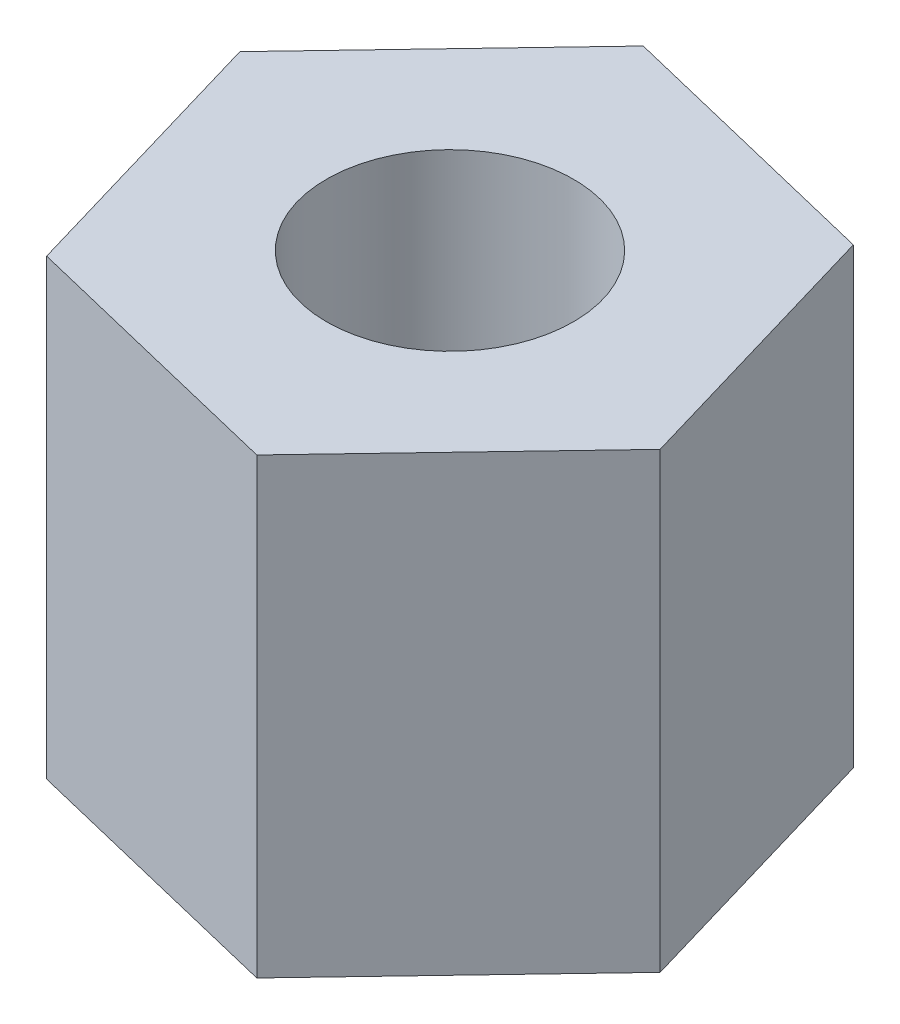
ISO-10303-21;
HEADER;
FILE_DESCRIPTION(('STEP AP214'),'2;1');
FILE_NAME('part.step','',(''),(''),'','','');
FILE_SCHEMA(('AUTOMOTIVE_DESIGN { 1 0 10303 214 1 1 1 1 }'));
ENDSEC;
DATA;
#1=APPLICATION_CONTEXT('core data for automotive mechanical design processes');
#2=APPLICATION_PROTOCOL_DEFINITION('international standard','automotive_design',2000,#1);
#3=PRODUCT_CONTEXT('',#1,'mechanical');
#4=PRODUCT('Part','Part','',(#3));
#5=PRODUCT_RELATED_PRODUCT_CATEGORY('part','',(#4));
#6=PRODUCT_DEFINITION_FORMATION('','',#4);
#7=PRODUCT_DEFINITION_CONTEXT('part definition',#1,'design');
#8=PRODUCT_DEFINITION('design','',#6,#7);
#9=PRODUCT_DEFINITION_SHAPE('','',#8);
#10=(LENGTH_UNIT() NAMED_UNIT(*) SI_UNIT(.MILLI.,.METRE.));
#11=(NAMED_UNIT(*) PLANE_ANGLE_UNIT() SI_UNIT($,.RADIAN.));
#12=(NAMED_UNIT(*) SI_UNIT($,.STERADIAN.) SOLID_ANGLE_UNIT());
#13=UNCERTAINTY_MEASURE_WITH_UNIT(LENGTH_MEASURE(1.E-05),#10,'distance_accuracy_value','');
#14=(GEOMETRIC_REPRESENTATION_CONTEXT(3) GLOBAL_UNCERTAINTY_ASSIGNED_CONTEXT((#13)) GLOBAL_UNIT_ASSIGNED_CONTEXT((#10,
#11,#12)) REPRESENTATION_CONTEXT('',''));
#15=CARTESIAN_POINT('',(0.,0.,0.));
#16=DIRECTION('',(0.,0.,1.));
#17=DIRECTION('',(1.,0.,0.));
#18=AXIS2_PLACEMENT_3D('',#15,#16,#17);
#19=CARTESIAN_POINT('',(0.,2.75,0.));
#20=DIRECTION('',(0.,1.,0.));
#21=DIRECTION('',(0.,0.,1.));
#22=AXIS2_PLACEMENT_3D('',#19,#20,#21);
#23=PLANE('',#22);
#24=DIRECTION('',(0.971906320154711,0.,0.235368020009788));
#25=VECTOR('',#24,1.);
#26=CARTESIAN_POINT('',(-2.38949518673463,2.75,2.50804959133029));
#27=LINE('',#26,#25);
#28=CARTESIAN_POINT('',(-2.38949518673463,2.75,2.50804959133029));
#29=VERTEX_POINT('',#28);
#30=CARTESIAN_POINT('',(0.9772870666759,2.75,3.32338832959798));
#31=VERTEX_POINT('',#30);
#32=EDGE_CURVE('E133',#29,#31,#27,.T.);
#33=ORIENTED_EDGE('',*,*,#32,.T.);
#34=DIRECTION('',(0.689787844644276,0.,-0.724011553347738));
#35=VECTOR('',#34,1.);
#36=CARTESIAN_POINT('',(0.9772870666759,2.75,3.32338832959798));
#37=LINE('',#36,#35);
#38=CARTESIAN_POINT('',(3.36678225341053,2.75,0.815338738267681));
#39=VERTEX_POINT('',#38);
#40=EDGE_CURVE('E91',#31,#39,#37,.T.);
#41=ORIENTED_EDGE('',*,*,#40,.T.);
#42=DIRECTION('',(-0.282118475510435,0.,-0.959379573357526));
#43=VECTOR('',#42,1.);
#44=CARTESIAN_POINT('',(3.36678225341053,2.75,0.815338738267681));
#45=LINE('',#44,#43);
#46=CARTESIAN_POINT('',(2.38949518673463,2.75,-2.50804959133029));
#47=VERTEX_POINT('',#46);
#48=EDGE_CURVE('E104',#39,#47,#45,.T.);
#49=ORIENTED_EDGE('',*,*,#48,.T.);
#50=DIRECTION('',(-0.971906320154711,0.,-0.235368020009788));
#51=VECTOR('',#50,1.);
#52=CARTESIAN_POINT('',(2.38949518673463,2.75,-2.50804959133029));
#53=LINE('',#52,#51);
#54=CARTESIAN_POINT('',(-0.977287066675899,2.75,-3.32338832959798));
#55=VERTEX_POINT('',#54);
#56=EDGE_CURVE('E98',#47,#55,#53,.T.);
#57=ORIENTED_EDGE('',*,*,#56,.T.);
#58=DIRECTION('',(-0.689787844644276,0.,0.724011553347738));
#59=VECTOR('',#58,1.);
#60=CARTESIAN_POINT('',(-0.977287066675899,2.75,-3.32338832959798));
#61=LINE('',#60,#59);
#62=CARTESIAN_POINT('',(-3.36678225341053,2.75,-0.815338738267681));
#63=VERTEX_POINT('',#62);
#64=EDGE_CURVE('E102',#55,#63,#61,.T.);
#65=ORIENTED_EDGE('',*,*,#64,.T.);
#66=DIRECTION('',(0.282118475510435,0.,0.959379573357526));
#67=VECTOR('',#66,1.);
#68=CARTESIAN_POINT('',(-3.36678225341053,2.75,-0.815338738267681));
#69=LINE('',#68,#67);
#70=EDGE_CURVE('E54',#63,#29,#69,.T.);
#71=ORIENTED_EDGE('',*,*,#70,.T.);
#72=EDGE_LOOP('',(#33,#41,#49,#57,#65,#71));
#73=FACE_BOUND('',#72,.T.);
#74=CARTESIAN_POINT('',(0.,2.75,0.));
#75=DIRECTION('',(0.,1.,0.));
#76=DIRECTION('',(0.,0.,1.));
#77=AXIS2_PLACEMENT_3D('',#74,#75,#76);
#78=CIRCLE('',#77,1.5);
#79=CARTESIAN_POINT('',(0.,2.75,1.5));
#80=VERTEX_POINT('',#79);
#81=EDGE_CURVE('E126',#80,#80,#78,.T.);
#82=ORIENTED_EDGE('',*,*,#81,.F.);
#83=EDGE_LOOP('',(#82));
#84=FACE_BOUND('',#83,.T.);
#85=ADVANCED_FACE('F37',(#73,#84),#23,.T.);
#86=CARTESIAN_POINT('',(0.,-2.75,0.));
#87=DIRECTION('',(0.,1.,0.));
#88=DIRECTION('',(0.,0.,1.));
#89=AXIS2_PLACEMENT_3D('',#86,#87,#88);
#90=PLANE('',#89);
#91=DIRECTION('',(0.971906320154711,0.,0.235368020009788));
#92=VECTOR('',#91,1.);
#93=CARTESIAN_POINT('',(-2.38949518673463,-2.75,2.50804959133029));
#94=LINE('',#93,#92);
#95=CARTESIAN_POINT('',(-2.38949518673463,-2.75,2.50804959133029));
#96=VERTEX_POINT('',#95);
#97=CARTESIAN_POINT('',(0.9772870666759,-2.75,3.32338832959798));
#98=VERTEX_POINT('',#97);
#99=EDGE_CURVE('E122',#96,#98,#94,.T.);
#100=ORIENTED_EDGE('',*,*,#99,.F.);
#101=DIRECTION('',(0.282118475510435,0.,0.959379573357526));
#102=VECTOR('',#101,1.);
#103=CARTESIAN_POINT('',(-3.36678225341053,-2.75,-0.815338738267681));
#104=LINE('',#103,#102);
#105=CARTESIAN_POINT('',(-3.36678225341053,-2.75,-0.815338738267681));
#106=VERTEX_POINT('',#105);
#107=EDGE_CURVE('E83',#106,#96,#104,.T.);
#108=ORIENTED_EDGE('',*,*,#107,.F.);
#109=DIRECTION('',(-0.689787844644276,0.,0.724011553347738));
#110=VECTOR('',#109,1.);
#111=CARTESIAN_POINT('',(-0.977287066675899,-2.75,-3.32338832959798));
#112=LINE('',#111,#110);
#113=CARTESIAN_POINT('',(-0.977287066675899,-2.75,-3.32338832959798));
#114=VERTEX_POINT('',#113);
#115=EDGE_CURVE('E77',#114,#106,#112,.T.);
#116=ORIENTED_EDGE('',*,*,#115,.F.);
#117=DIRECTION('',(-0.971906320154711,0.,-0.235368020009788));
#118=VECTOR('',#117,1.);
#119=CARTESIAN_POINT('',(2.38949518673463,-2.75,-2.50804959133029));
#120=LINE('',#119,#118);
#121=CARTESIAN_POINT('',(2.38949518673463,-2.75,-2.50804959133029));
#122=VERTEX_POINT('',#121);
#123=EDGE_CURVE('E112',#122,#114,#120,.T.);
#124=ORIENTED_EDGE('',*,*,#123,.F.);
#125=DIRECTION('',(-0.282118475510435,0.,-0.959379573357526));
#126=VECTOR('',#125,1.);
#127=CARTESIAN_POINT('',(3.36678225341053,-2.75,0.815338738267681));
#128=LINE('',#127,#126);
#129=CARTESIAN_POINT('',(3.36678225341053,-2.75,0.815338738267681));
#130=VERTEX_POINT('',#129);
#131=EDGE_CURVE('E128',#130,#122,#128,.T.);
#132=ORIENTED_EDGE('',*,*,#131,.F.);
#133=DIRECTION('',(0.689787844644276,0.,-0.724011553347738));
#134=VECTOR('',#133,1.);
#135=CARTESIAN_POINT('',(0.9772870666759,-2.75,3.32338832959798));
#136=LINE('',#135,#134);
#137=EDGE_CURVE('E125',#98,#130,#136,.T.);
#138=ORIENTED_EDGE('',*,*,#137,.F.);
#139=EDGE_LOOP('',(#100,#108,#116,#124,#132,#138));
#140=FACE_BOUND('',#139,.T.);
#141=CARTESIAN_POINT('',(0.,-2.75,0.));
#142=DIRECTION('',(0.,1.,0.));
#143=DIRECTION('',(0.,0.,1.));
#144=AXIS2_PLACEMENT_3D('',#141,#142,#143);
#145=CIRCLE('',#144,1.5);
#146=CARTESIAN_POINT('',(0.,-2.75,1.5));
#147=VERTEX_POINT('',#146);
#148=EDGE_CURVE('E226',#147,#147,#145,.T.);
#149=ORIENTED_EDGE('',*,*,#148,.T.);
#150=EDGE_LOOP('',(#149));
#151=FACE_BOUND('',#150,.T.);
#152=ADVANCED_FACE('F142',(#140,#151),#90,.F.);
#153=CARTESIAN_POINT('',(-2.38949518673463,2.75,2.50804959133029));
#154=DIRECTION('',(0.235368020009788,0.,-0.971906320154711));
#155=DIRECTION('',(-0.971906320154711,0.,-0.235368020009788));
#156=AXIS2_PLACEMENT_3D('',#153,#154,#155);
#157=PLANE('',#156);
#158=ORIENTED_EDGE('',*,*,#99,.T.);
#159=DIRECTION('',(0.,-1.,0.));
#160=VECTOR('',#159,1.);
#161=CARTESIAN_POINT('',(0.9772870666759,2.75,3.32338832959798));
#162=LINE('',#161,#160);
#163=EDGE_CURVE('E11',#31,#98,#162,.T.);
#164=ORIENTED_EDGE('',*,*,#163,.F.);
#165=ORIENTED_EDGE('',*,*,#32,.F.);
#166=DIRECTION('',(0.,-1.,0.));
#167=VECTOR('',#166,1.);
#168=CARTESIAN_POINT('',(-2.38949518673463,2.75,2.50804959133029));
#169=LINE('',#168,#167);
#170=EDGE_CURVE('E118',#29,#96,#169,.T.);
#171=ORIENTED_EDGE('',*,*,#170,.T.);
#172=EDGE_LOOP('',(#158,#164,#165,#171));
#173=FACE_BOUND('',#172,.T.);
#174=ADVANCED_FACE('F39',(#173),#157,.F.);
#175=CARTESIAN_POINT('',(0.9772870666759,2.75,3.32338832959798));
#176=DIRECTION('',(-0.724011553347738,0.,-0.689787844644276));
#177=DIRECTION('',(-0.689787844644276,0.,0.724011553347738));
#178=AXIS2_PLACEMENT_3D('',#175,#176,#177);
#179=PLANE('',#178);
#180=ORIENTED_EDGE('',*,*,#137,.T.);
#181=DIRECTION('',(0.,-1.,0.));
#182=VECTOR('',#181,1.);
#183=CARTESIAN_POINT('',(3.36678225341053,2.75,0.815338738267681));
#184=LINE('',#183,#182);
#185=EDGE_CURVE('E46',#39,#130,#184,.T.);
#186=ORIENTED_EDGE('',*,*,#185,.F.);
#187=ORIENTED_EDGE('',*,*,#40,.F.);
#188=ORIENTED_EDGE('',*,*,#163,.T.);
#189=EDGE_LOOP('',(#180,#186,#187,#188));
#190=FACE_BOUND('',#189,.T.);
#191=ADVANCED_FACE('F167',(#190),#179,.F.);
#192=CARTESIAN_POINT('',(3.36678225341053,2.75,0.815338738267681));
#193=DIRECTION('',(-0.959379573357526,0.,0.282118475510435));
#194=DIRECTION('',(0.282118475510435,0.,0.959379573357526));
#195=AXIS2_PLACEMENT_3D('',#192,#193,#194);
#196=PLANE('',#195);
#197=ORIENTED_EDGE('',*,*,#131,.T.);
#198=DIRECTION('',(0.,-1.,0.));
#199=VECTOR('',#198,1.);
#200=CARTESIAN_POINT('',(2.38949518673463,2.75,-2.50804959133029));
#201=LINE('',#200,#199);
#202=EDGE_CURVE('E113',#47,#122,#201,.T.);
#203=ORIENTED_EDGE('',*,*,#202,.F.);
#204=ORIENTED_EDGE('',*,*,#48,.F.);
#205=ORIENTED_EDGE('',*,*,#185,.T.);
#206=EDGE_LOOP('',(#197,#203,#204,#205));
#207=FACE_BOUND('',#206,.T.);
#208=ADVANCED_FACE('F139',(#207),#196,.F.);
#209=CARTESIAN_POINT('',(2.38949518673463,2.75,-2.50804959133029));
#210=DIRECTION('',(-0.235368020009788,0.,0.971906320154711));
#211=DIRECTION('',(0.971906320154711,0.,0.235368020009788));
#212=AXIS2_PLACEMENT_3D('',#209,#210,#211);
#213=PLANE('',#212);
#214=ORIENTED_EDGE('',*,*,#123,.T.);
#215=DIRECTION('',(0.,-1.,0.));
#216=VECTOR('',#215,1.);
#217=CARTESIAN_POINT('',(-0.977287066675899,2.75,-3.32338832959798));
#218=LINE('',#217,#216);
#219=EDGE_CURVE('E109',#55,#114,#218,.T.);
#220=ORIENTED_EDGE('',*,*,#219,.F.);
#221=ORIENTED_EDGE('',*,*,#56,.F.);
#222=ORIENTED_EDGE('',*,*,#202,.T.);
#223=EDGE_LOOP('',(#214,#220,#221,#222));
#224=FACE_BOUND('',#223,.T.);
#225=ADVANCED_FACE('F110',(#224),#213,.F.);
#226=CARTESIAN_POINT('',(-0.977287066675899,2.75,-3.32338832959798));
#227=DIRECTION('',(0.724011553347738,0.,0.689787844644276));
#228=DIRECTION('',(0.689787844644276,0.,-0.724011553347738));
#229=AXIS2_PLACEMENT_3D('',#226,#227,#228);
#230=PLANE('',#229);
#231=ORIENTED_EDGE('',*,*,#115,.T.);
#232=DIRECTION('',(0.,-1.,0.));
#233=VECTOR('',#232,1.);
#234=CARTESIAN_POINT('',(-3.36678225341053,2.75,-0.815338738267681));
#235=LINE('',#234,#233);
#236=EDGE_CURVE('E114',#63,#106,#235,.T.);
#237=ORIENTED_EDGE('',*,*,#236,.F.);
#238=ORIENTED_EDGE('',*,*,#64,.F.);
#239=ORIENTED_EDGE('',*,*,#219,.T.);
#240=EDGE_LOOP('',(#231,#237,#238,#239));
#241=FACE_BOUND('',#240,.T.);
#242=ADVANCED_FACE('F116',(#241),#230,.F.);
#243=CARTESIAN_POINT('',(-3.36678225341053,2.75,-0.815338738267681));
#244=DIRECTION('',(0.959379573357526,0.,-0.282118475510435));
#245=DIRECTION('',(-0.282118475510435,0.,-0.959379573357526));
#246=AXIS2_PLACEMENT_3D('',#243,#244,#245);
#247=PLANE('',#246);
#248=ORIENTED_EDGE('',*,*,#107,.T.);
#249=ORIENTED_EDGE('',*,*,#170,.F.);
#250=ORIENTED_EDGE('',*,*,#70,.F.);
#251=ORIENTED_EDGE('',*,*,#236,.T.);
#252=EDGE_LOOP('',(#248,#249,#250,#251));
#253=FACE_BOUND('',#252,.T.);
#254=ADVANCED_FACE('F147',(#253),#247,.F.);
#255=CARTESIAN_POINT('',(0.,2.75,0.));
#256=DIRECTION('',(0.,-1.,0.));
#257=DIRECTION('',(0.,0.,-1.));
#258=AXIS2_PLACEMENT_3D('',#255,#256,#257);
#259=CYLINDRICAL_SURFACE('',#258,1.5);
#260=ORIENTED_EDGE('',*,*,#81,.T.);
#261=EDGE_LOOP('',(#260));
#262=FACE_BOUND('',#261,.T.);
#263=ORIENTED_EDGE('',*,*,#148,.F.);
#264=EDGE_LOOP('',(#263));
#265=FACE_BOUND('',#264,.T.);
#266=ADVANCED_FACE('F149',(#262,#265),#259,.F.);
#267=CLOSED_SHELL('',(#85,#152,#174,#191,#208,#225,#242,#254,#266));
#268=MANIFOLD_SOLID_BREP('B2',#267);
#269=ADVANCED_BREP_SHAPE_REPRESENTATION('',(#18,#268),#14);
#270=SHAPE_DEFINITION_REPRESENTATION(#9,#269);
ENDSEC;
END-ISO-10303-21;
